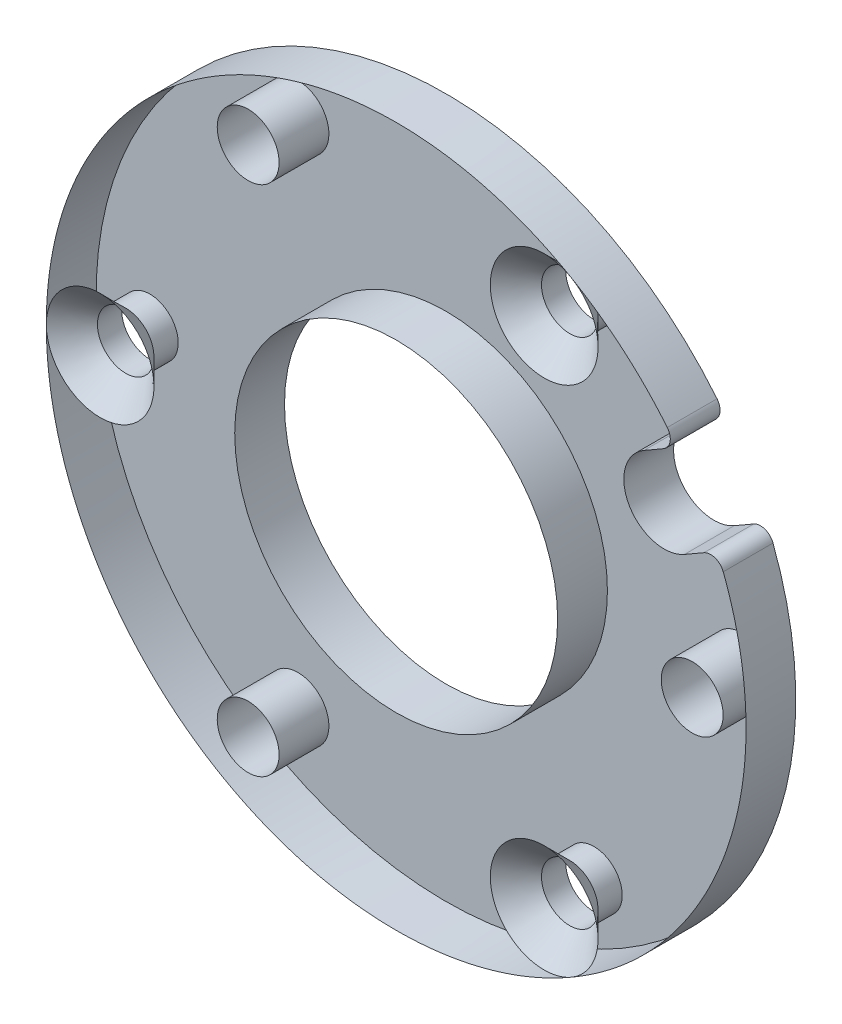
ISO-10303-21;
HEADER;
FILE_DESCRIPTION(('STEP AP214'),'2;1');
FILE_NAME('part.step','',(''),(''),'','','');
FILE_SCHEMA(('AUTOMOTIVE_DESIGN { 1 0 10303 214 1 1 1 1 }'));
ENDSEC;
DATA;
#1=APPLICATION_CONTEXT('core data for automotive mechanical design processes');
#2=APPLICATION_PROTOCOL_DEFINITION('international standard','automotive_design',2000,#1);
#3=PRODUCT_CONTEXT('',#1,'mechanical');
#4=PRODUCT('Part','Part','',(#3));
#5=PRODUCT_RELATED_PRODUCT_CATEGORY('part','',(#4));
#6=PRODUCT_DEFINITION_FORMATION('','',#4);
#7=PRODUCT_DEFINITION_CONTEXT('part definition',#1,'design');
#8=PRODUCT_DEFINITION('design','',#6,#7);
#9=PRODUCT_DEFINITION_SHAPE('','',#8);
#10=(LENGTH_UNIT() NAMED_UNIT(*) SI_UNIT(.MILLI.,.METRE.));
#11=(NAMED_UNIT(*) PLANE_ANGLE_UNIT() SI_UNIT($,.RADIAN.));
#12=(NAMED_UNIT(*) SI_UNIT($,.STERADIAN.) SOLID_ANGLE_UNIT());
#13=UNCERTAINTY_MEASURE_WITH_UNIT(LENGTH_MEASURE(1.E-05),#10,'distance_accuracy_value','');
#14=(GEOMETRIC_REPRESENTATION_CONTEXT(3) GLOBAL_UNCERTAINTY_ASSIGNED_CONTEXT((#13)) GLOBAL_UNIT_ASSIGNED_CONTEXT((#10,
#11,#12)) REPRESENTATION_CONTEXT('',''));
#15=CARTESIAN_POINT('',(0.,0.,0.));
#16=DIRECTION('',(0.,0.,1.));
#17=DIRECTION('',(1.,0.,0.));
#18=AXIS2_PLACEMENT_3D('',#15,#16,#17);
#19=CARTESIAN_POINT('',(0.,-1.35,12.05));
#20=DIRECTION('',(0.,0.,1.));
#21=DIRECTION('',(0.,1.,0.));
#22=AXIS2_PLACEMENT_3D('',#19,#20,#21);
#23=CYLINDRICAL_SURFACE('',#22,6.);
#24=CARTESIAN_POINT('',(0.,-1.35,13.9));
#25=DIRECTION('',(0.,0.,-1.));
#26=DIRECTION('',(0.,-1.,0.));
#27=AXIS2_PLACEMENT_3D('',#24,#25,#26);
#28=CIRCLE('',#27,6.);
#29=CARTESIAN_POINT('',(0.,-7.35,13.9));
#30=VERTEX_POINT('',#29);
#31=EDGE_CURVE('E126',#30,#30,#28,.T.);
#32=ORIENTED_EDGE('',*,*,#31,.F.);
#33=EDGE_LOOP('',(#32));
#34=FACE_BOUND('',#33,.T.);
#35=CARTESIAN_POINT('',(0.,-1.35,12.05));
#36=DIRECTION('',(0.,0.,1.));
#37=DIRECTION('',(0.,1.,0.));
#38=AXIS2_PLACEMENT_3D('',#35,#36,#37);
#39=CIRCLE('',#38,6.);
#40=CARTESIAN_POINT('',(0.,4.65,12.05));
#41=VERTEX_POINT('',#40);
#42=EDGE_CURVE('E11',#41,#41,#39,.T.);
#43=ORIENTED_EDGE('',*,*,#42,.F.);
#44=EDGE_LOOP('',(#43));
#45=FACE_BOUND('',#44,.T.);
#46=ADVANCED_FACE('F16',(#34,#45),#23,.F.);
#47=CARTESIAN_POINT('',(2.75,-6.113139720814,12.05));
#48=DIRECTION('',(0.,0.,1.));
#49=DIRECTION('',(1.,0.,0.));
#50=AXIS2_PLACEMENT_3D('',#47,#48,#49);
#51=PLANE('',#50);
#52=CARTESIAN_POINT('',(9.685855136581,6.551532147195,12.05));
#53=DIRECTION('',(0.,0.,-1.));
#54=DIRECTION('',(0.774868410926516,0.632122571775613,0.));
#55=AXIS2_PLACEMENT_3D('',#52,#53,#54);
#56=CIRCLE('',#55,0.5);
#57=CARTESIAN_POINT('',(10.07328934204,6.867593433083,12.05));
#58=VERTEX_POINT('',#57);
#59=CARTESIAN_POINT('',(9.935855136581,6.118519445303,12.05));
#60=VERTEX_POINT('',#59);
#61=EDGE_CURVE('E41',#58,#60,#56,.T.);
#62=ORIENTED_EDGE('',*,*,#61,.T.);
#63=DIRECTION('',(-0.866025403784429,-0.500000000000017,0.));
#64=VECTOR('',#63,1.);
#65=CARTESIAN_POINT('',(9.935855136581,6.118519445303,12.05));
#66=LINE('',#65,#64);
#67=CARTESIAN_POINT('',(9.209292143521,5.699038105677,12.05));
#68=VERTEX_POINT('',#67);
#69=EDGE_CURVE('E162',#60,#68,#66,.T.);
#70=ORIENTED_EDGE('',*,*,#69,.T.);
#71=CARTESIAN_POINT('',(9.959292143521,4.4,12.05));
#72=DIRECTION('',(0.,0.,1.));
#73=DIRECTION('',(-0.500000000000017,0.866025403784429,0.));
#74=AXIS2_PLACEMENT_3D('',#71,#72,#73);
#75=CIRCLE('',#74,1.5);
#76=CARTESIAN_POINT('',(10.70929214352,3.100961894323,12.05));
#77=VERTEX_POINT('',#76);
#78=EDGE_CURVE('E152',#68,#77,#75,.T.);
#79=ORIENTED_EDGE('',*,*,#78,.T.);
#80=DIRECTION('',(0.866025403784429,0.500000000000017,0.));
#81=VECTOR('',#80,1.);
#82=CARTESIAN_POINT('',(10.70929214352,3.100961894323,12.05));
#83=LINE('',#82,#81);
#84=CARTESIAN_POINT('',(11.43585513658,3.52044323395,12.05));
#85=VERTEX_POINT('',#84);
#86=EDGE_CURVE('E145',#77,#85,#83,.T.);
#87=ORIENTED_EDGE('',*,*,#86,.T.);
#88=CARTESIAN_POINT('',(11.68585513658,3.087430532058,12.05));
#89=DIRECTION('',(0.,0.,-1.));
#90=DIRECTION('',(-0.499999999999974,0.866025403784454,0.));
#91=AXIS2_PLACEMENT_3D('',#88,#89,#90);
#92=CIRCLE('',#91,0.5);
#93=CARTESIAN_POINT('',(12.15328934204,3.26492775334,12.05));
#94=VERTEX_POINT('',#93);
#95=EDGE_CURVE('E180',#85,#94,#92,.T.);
#96=ORIENTED_EDGE('',*,*,#95,.T.);
#97=CARTESIAN_POINT('',(0.,-1.35,12.05));
#98=DIRECTION('',(0.,0.,-1.));
#99=DIRECTION('',(0.934868410926505,0.354994442564601,0.));
#100=AXIS2_PLACEMENT_3D('',#97,#98,#99);
#101=CIRCLE('',#100,13.);
#102=EDGE_CURVE('E24',#94,#58,#101,.T.);
#103=ORIENTED_EDGE('',*,*,#102,.T.);
#104=EDGE_LOOP('',(#62,#70,#79,#87,#96,#103));
#105=FACE_BOUND('',#104,.T.);
#106=CARTESIAN_POINT('',(5.5,-10.87627944163,12.05));
#107=DIRECTION('',(0.,0.,1.));
#108=DIRECTION('',(0.,1.,0.));
#109=AXIS2_PLACEMENT_3D('',#106,#107,#108);
#110=CIRCLE('',#109,1.05);
#111=CARTESIAN_POINT('',(5.5,-9.82627944163,12.05));
#112=VERTEX_POINT('',#111);
#113=EDGE_CURVE('E184',#112,#112,#110,.T.);
#114=ORIENTED_EDGE('',*,*,#113,.T.);
#115=EDGE_LOOP('',(#114));
#116=FACE_BOUND('',#115,.T.);
#117=CARTESIAN_POINT('',(11.,-1.35,12.05));
#118=DIRECTION('',(0.,0.,1.));
#119=DIRECTION('',(0.,-1.,0.));
#120=AXIS2_PLACEMENT_3D('',#117,#118,#119);
#121=CIRCLE('',#120,1.15);
#122=CARTESIAN_POINT('',(11.,-2.5,12.05));
#123=VERTEX_POINT('',#122);
#124=EDGE_CURVE('E242',#123,#123,#121,.T.);
#125=ORIENTED_EDGE('',*,*,#124,.T.);
#126=EDGE_LOOP('',(#125));
#127=FACE_BOUND('',#126,.T.);
#128=CARTESIAN_POINT('',(5.5,8.176279441629,12.05));
#129=DIRECTION('',(0.,0.,1.));
#130=DIRECTION('',(0.,-1.,0.));
#131=AXIS2_PLACEMENT_3D('',#128,#129,#130);
#132=CIRCLE('',#131,1.05);
#133=CARTESIAN_POINT('',(5.5,7.126279441629,12.05));
#134=VERTEX_POINT('',#133);
#135=EDGE_CURVE('E237',#134,#134,#132,.T.);
#136=ORIENTED_EDGE('',*,*,#135,.T.);
#137=EDGE_LOOP('',(#136));
#138=FACE_BOUND('',#137,.T.);
#139=CARTESIAN_POINT('',(-5.5,-10.87627944163,12.05));
#140=DIRECTION('',(0.,0.,1.));
#141=DIRECTION('',(0.,-1.,0.));
#142=AXIS2_PLACEMENT_3D('',#139,#140,#141);
#143=CIRCLE('',#142,1.15);
#144=CARTESIAN_POINT('',(-5.5,-12.02627944163,12.05));
#145=VERTEX_POINT('',#144);
#146=EDGE_CURVE('E240',#145,#145,#143,.T.);
#147=ORIENTED_EDGE('',*,*,#146,.T.);
#148=EDGE_LOOP('',(#147));
#149=FACE_BOUND('',#148,.T.);
#150=ORIENTED_EDGE('',*,*,#42,.T.);
#151=EDGE_LOOP('',(#150));
#152=FACE_BOUND('',#151,.T.);
#153=CARTESIAN_POINT('',(-11.,-1.35,12.05));
#154=DIRECTION('',(0.,0.,1.));
#155=DIRECTION('',(0.,-1.,0.));
#156=AXIS2_PLACEMENT_3D('',#153,#154,#155);
#157=CIRCLE('',#156,1.05);
#158=CARTESIAN_POINT('',(-11.,-2.4,12.05));
#159=VERTEX_POINT('',#158);
#160=EDGE_CURVE('E176',#159,#159,#157,.T.);
#161=ORIENTED_EDGE('',*,*,#160,.T.);
#162=EDGE_LOOP('',(#161));
#163=FACE_BOUND('',#162,.T.);
#164=CARTESIAN_POINT('',(-5.5,8.176279441629,12.05));
#165=DIRECTION('',(0.,0.,1.));
#166=DIRECTION('',(0.,1.,0.));
#167=AXIS2_PLACEMENT_3D('',#164,#165,#166);
#168=CIRCLE('',#167,1.15);
#169=CARTESIAN_POINT('',(-5.5,9.326279441629,12.05));
#170=VERTEX_POINT('',#169);
#171=EDGE_CURVE('E265',#170,#170,#168,.T.);
#172=ORIENTED_EDGE('',*,*,#171,.T.);
#173=EDGE_LOOP('',(#172));
#174=FACE_BOUND('',#173,.T.);
#175=ADVANCED_FACE('F275',(#105,#116,#127,#138,#149,#152,#163,#174),#51,.F.);
#176=CARTESIAN_POINT('',(0.,-1.35,12.05));
#177=DIRECTION('',(0.,0.,1.));
#178=DIRECTION('',(0.,1.,0.));
#179=AXIS2_PLACEMENT_3D('',#176,#177,#178);
#180=CYLINDRICAL_SURFACE('',#179,13.);
#181=DIRECTION('',(0.,0.,1.));
#182=VECTOR('',#181,1.);
#183=CARTESIAN_POINT('',(10.07328934204,6.867593433083,12.05));
#184=LINE('',#183,#182);
#185=CARTESIAN_POINT('',(10.07328934204,6.867593433083,13.9));
#186=VERTEX_POINT('',#185);
#187=EDGE_CURVE('E165',#58,#186,#184,.T.);
#188=ORIENTED_EDGE('',*,*,#187,.F.);
#189=ORIENTED_EDGE('',*,*,#102,.F.);
#190=DIRECTION('',(0.,0.,-1.));
#191=VECTOR('',#190,1.);
#192=CARTESIAN_POINT('',(12.15328934204,3.26492775334,13.9));
#193=LINE('',#192,#191);
#194=CARTESIAN_POINT('',(12.15328934204,3.26492775334,13.9));
#195=VERTEX_POINT('',#194);
#196=EDGE_CURVE('E103',#195,#94,#193,.T.);
#197=ORIENTED_EDGE('',*,*,#196,.F.);
#198=CARTESIAN_POINT('',(0.,-1.35,13.9));
#199=DIRECTION('',(0.,0.,1.));
#200=DIRECTION('',(0.500000000000017,-0.866025403784429,0.));
#201=AXIS2_PLACEMENT_3D('',#198,#199,#200);
#202=CIRCLE('',#201,13.);
#203=CARTESIAN_POINT('',(6.5,-12.6083302492,13.9));
#204=VERTEX_POINT('',#203);
#205=EDGE_CURVE('E95',#204,#195,#202,.T.);
#206=ORIENTED_EDGE('',*,*,#205,.F.);
#207=CARTESIAN_POINT('',(0.,-1.35,13.9));
#208=DIRECTION('',(0.,0.,1.));
#209=DIRECTION('',(-1.,0.,0.));
#210=AXIS2_PLACEMENT_3D('',#207,#208,#209);
#211=CIRCLE('',#210,13.);
#212=CARTESIAN_POINT('',(-13.,-1.35,13.9));
#213=VERTEX_POINT('',#212);
#214=EDGE_CURVE('E100',#213,#204,#211,.T.);
#215=ORIENTED_EDGE('',*,*,#214,.F.);
#216=CARTESIAN_POINT('',(0.,-1.35,13.9));
#217=DIRECTION('',(0.,0.,1.));
#218=DIRECTION('',(0.500000000000017,0.866025403784429,0.));
#219=AXIS2_PLACEMENT_3D('',#216,#217,#218);
#220=CIRCLE('',#219,13.);
#221=CARTESIAN_POINT('',(6.5,9.908330249198,13.9));
#222=VERTEX_POINT('',#221);
#223=EDGE_CURVE('E120',#222,#213,#220,.T.);
#224=ORIENTED_EDGE('',*,*,#223,.F.);
#225=CARTESIAN_POINT('',(0.,-1.35,13.9));
#226=DIRECTION('',(0.,0.,1.));
#227=DIRECTION('',(0.774868410926516,0.632122571775613,0.));
#228=AXIS2_PLACEMENT_3D('',#225,#226,#227);
#229=CIRCLE('',#228,13.);
#230=EDGE_CURVE('E142',#186,#222,#229,.T.);
#231=ORIENTED_EDGE('',*,*,#230,.F.);
#232=EDGE_LOOP('',(#188,#189,#197,#206,#215,#224,#231));
#233=FACE_BOUND('',#232,.T.);
#234=ADVANCED_FACE('F98',(#233),#180,.T.);
#235=CARTESIAN_POINT('',(9.685855136581,6.551532147195,12.05));
#236=DIRECTION('',(0.,0.,1.));
#237=DIRECTION('',(0.,1.,0.));
#238=AXIS2_PLACEMENT_3D('',#235,#236,#237);
#239=CYLINDRICAL_SURFACE('',#238,0.5);
#240=ORIENTED_EDGE('',*,*,#187,.T.);
#241=CARTESIAN_POINT('',(9.685855136581,6.551532147195,13.9));
#242=DIRECTION('',(0.,0.,1.));
#243=DIRECTION('',(0.500000000000017,-0.866025403784429,0.));
#244=AXIS2_PLACEMENT_3D('',#241,#242,#243);
#245=CIRCLE('',#244,0.5);
#246=CARTESIAN_POINT('',(9.935855136581,6.118519445303,13.9));
#247=VERTEX_POINT('',#246);
#248=EDGE_CURVE('E141',#247,#186,#245,.T.);
#249=ORIENTED_EDGE('',*,*,#248,.F.);
#250=DIRECTION('',(0.,0.,-1.));
#251=VECTOR('',#250,1.);
#252=CARTESIAN_POINT('',(9.935855136581,6.118519445303,13.9));
#253=LINE('',#252,#251);
#254=EDGE_CURVE('E158',#247,#60,#253,.T.);
#255=ORIENTED_EDGE('',*,*,#254,.T.);
#256=ORIENTED_EDGE('',*,*,#61,.F.);
#257=EDGE_LOOP('',(#240,#249,#255,#256));
#258=FACE_BOUND('',#257,.T.);
#259=ADVANCED_FACE('F336',(#258),#239,.T.);
#260=CARTESIAN_POINT('',(10.43313462317,6.405623890749,12.));
#261=DIRECTION('',(-0.500000000000017,0.866025403784429,0.));
#262=DIRECTION('',(0.,0.,1.));
#263=AXIS2_PLACEMENT_3D('',#260,#261,#262);
#264=PLANE('',#263);
#265=ORIENTED_EDGE('',*,*,#254,.F.);
#266=DIRECTION('',(0.866025403784429,0.500000000000017,0.));
#267=VECTOR('',#266,1.);
#268=CARTESIAN_POINT('',(9.209292143521,5.699038105677,13.9));
#269=LINE('',#268,#267);
#270=CARTESIAN_POINT('',(9.209292143521,5.699038105677,13.9));
#271=VERTEX_POINT('',#270);
#272=EDGE_CURVE('E137',#271,#247,#269,.T.);
#273=ORIENTED_EDGE('',*,*,#272,.F.);
#274=DIRECTION('',(0.,0.,1.));
#275=VECTOR('',#274,1.);
#276=CARTESIAN_POINT('',(9.209292143521,5.699038105677,12.05));
#277=LINE('',#276,#275);
#278=EDGE_CURVE('E155',#68,#271,#277,.T.);
#279=ORIENTED_EDGE('',*,*,#278,.F.);
#280=ORIENTED_EDGE('',*,*,#69,.F.);
#281=EDGE_LOOP('',(#265,#273,#279,#280));
#282=FACE_BOUND('',#281,.T.);
#283=ADVANCED_FACE('F334',(#282),#264,.F.);
#284=CARTESIAN_POINT('',(9.959292143521,4.4,12.));
#285=DIRECTION('',(0.,0.,1.));
#286=DIRECTION('',(0.,1.,0.));
#287=AXIS2_PLACEMENT_3D('',#284,#285,#286);
#288=CYLINDRICAL_SURFACE('',#287,1.5);
#289=CARTESIAN_POINT('',(9.959292143521,4.4,13.9));
#290=DIRECTION('',(0.,0.,-1.));
#291=DIRECTION('',(0.,-1.,0.));
#292=AXIS2_PLACEMENT_3D('',#289,#290,#291);
#293=CIRCLE('',#292,1.5);
#294=CARTESIAN_POINT('',(10.70929214352,3.100961894323,13.9));
#295=VERTEX_POINT('',#294);
#296=EDGE_CURVE('E133',#295,#271,#293,.T.);
#297=ORIENTED_EDGE('',*,*,#296,.F.);
#298=DIRECTION('',(0.,0.,-1.));
#299=VECTOR('',#298,1.);
#300=CARTESIAN_POINT('',(10.70929214352,3.100961894323,13.9));
#301=LINE('',#300,#299);
#302=EDGE_CURVE('E148',#295,#77,#301,.T.);
#303=ORIENTED_EDGE('',*,*,#302,.T.);
#304=ORIENTED_EDGE('',*,*,#78,.F.);
#305=ORIENTED_EDGE('',*,*,#278,.T.);
#306=EDGE_LOOP('',(#297,#303,#304,#305));
#307=FACE_BOUND('',#306,.T.);
#308=ADVANCED_FACE('F330',(#307),#288,.F.);
#309=CARTESIAN_POINT('',(10.70929214352,3.100961894323,12.));
#310=DIRECTION('',(0.500000000000017,-0.866025403784429,0.));
#311=DIRECTION('',(0.,0.,-1.));
#312=AXIS2_PLACEMENT_3D('',#309,#310,#311);
#313=PLANE('',#312);
#314=DIRECTION('',(0.,0.,1.));
#315=VECTOR('',#314,1.);
#316=CARTESIAN_POINT('',(11.43585513658,3.52044323395,12.05));
#317=LINE('',#316,#315);
#318=CARTESIAN_POINT('',(11.43585513658,3.52044323395,13.9));
#319=VERTEX_POINT('',#318);
#320=EDGE_CURVE('E194',#85,#319,#317,.T.);
#321=ORIENTED_EDGE('',*,*,#320,.F.);
#322=ORIENTED_EDGE('',*,*,#86,.F.);
#323=ORIENTED_EDGE('',*,*,#302,.F.);
#324=DIRECTION('',(-0.866025403784429,-0.500000000000017,0.));
#325=VECTOR('',#324,1.);
#326=CARTESIAN_POINT('',(11.43585513658,3.52044323395,13.9));
#327=LINE('',#326,#325);
#328=EDGE_CURVE('E109',#319,#295,#327,.T.);
#329=ORIENTED_EDGE('',*,*,#328,.F.);
#330=EDGE_LOOP('',(#321,#322,#323,#329));
#331=FACE_BOUND('',#330,.T.);
#332=ADVANCED_FACE('F322',(#331),#313,.F.);
#333=CARTESIAN_POINT('',(2.75,-6.113139720814,13.9));
#334=DIRECTION('',(0.,0.,1.));
#335=DIRECTION('',(1.,0.,0.));
#336=AXIS2_PLACEMENT_3D('',#333,#334,#335);
#337=PLANE('',#336);
#338=CARTESIAN_POINT('',(5.5,8.176279441629,13.9));
#339=DIRECTION('',(0.,0.,-1.));
#340=DIRECTION('',(0.500000000000017,0.866025403784429,0.));
#341=AXIS2_PLACEMENT_3D('',#338,#339,#340);
#342=CIRCLE('',#341,2.);
#343=EDGE_CURVE('E224',#222,#222,#342,.T.);
#344=ORIENTED_EDGE('',*,*,#343,.T.);
#345=ORIENTED_EDGE('',*,*,#223,.T.);
#346=CARTESIAN_POINT('',(-11.,-1.35,13.9));
#347=DIRECTION('',(0.,0.,-1.));
#348=DIRECTION('',(-1.,0.,0.));
#349=AXIS2_PLACEMENT_3D('',#346,#347,#348);
#350=CIRCLE('',#349,2.);
#351=EDGE_CURVE('E118',#213,#213,#350,.T.);
#352=ORIENTED_EDGE('',*,*,#351,.T.);
#353=ORIENTED_EDGE('',*,*,#214,.T.);
#354=CARTESIAN_POINT('',(5.5,-10.87627944163,13.9));
#355=DIRECTION('',(0.,0.,-1.));
#356=DIRECTION('',(0.500000000000092,-0.866025403784386,0.));
#357=AXIS2_PLACEMENT_3D('',#354,#355,#356);
#358=CIRCLE('',#357,2.);
#359=EDGE_CURVE('E116',#204,#204,#358,.T.);
#360=ORIENTED_EDGE('',*,*,#359,.T.);
#361=ORIENTED_EDGE('',*,*,#205,.T.);
#362=CARTESIAN_POINT('',(11.68585513658,3.087430532058,13.9));
#363=DIRECTION('',(0.,0.,1.));
#364=DIRECTION('',(0.934868410926505,0.354994442564601,0.));
#365=AXIS2_PLACEMENT_3D('',#362,#363,#364);
#366=CIRCLE('',#365,0.5);
#367=EDGE_CURVE('E198',#195,#319,#366,.T.);
#368=ORIENTED_EDGE('',*,*,#367,.T.);
#369=ORIENTED_EDGE('',*,*,#328,.T.);
#370=ORIENTED_EDGE('',*,*,#296,.T.);
#371=ORIENTED_EDGE('',*,*,#272,.T.);
#372=ORIENTED_EDGE('',*,*,#248,.T.);
#373=ORIENTED_EDGE('',*,*,#230,.T.);
#374=EDGE_LOOP('',(#344,#345,#352,#353,#360,#361,#368,#369,#370,#371,#372,#373));
#375=FACE_BOUND('',#374,.T.);
#376=CARTESIAN_POINT('',(11.,-1.35,13.9));
#377=DIRECTION('',(0.,0.,-1.));
#378=DIRECTION('',(0.,1.,0.));
#379=AXIS2_PLACEMENT_3D('',#376,#377,#378);
#380=CIRCLE('',#379,1.15);
#381=CARTESIAN_POINT('',(11.,-0.2,13.9));
#382=VERTEX_POINT('',#381);
#383=EDGE_CURVE('E214',#382,#382,#380,.T.);
#384=ORIENTED_EDGE('',*,*,#383,.T.);
#385=EDGE_LOOP('',(#384));
#386=FACE_BOUND('',#385,.T.);
#387=CARTESIAN_POINT('',(-5.5,-10.87627944163,13.9));
#388=DIRECTION('',(0.,0.,-1.));
#389=DIRECTION('',(0.,1.,0.));
#390=AXIS2_PLACEMENT_3D('',#387,#388,#389);
#391=CIRCLE('',#390,1.15);
#392=CARTESIAN_POINT('',(-5.5,-9.72627944163,13.9));
#393=VERTEX_POINT('',#392);
#394=EDGE_CURVE('E245',#393,#393,#391,.T.);
#395=ORIENTED_EDGE('',*,*,#394,.T.);
#396=EDGE_LOOP('',(#395));
#397=FACE_BOUND('',#396,.T.);
#398=ORIENTED_EDGE('',*,*,#31,.T.);
#399=EDGE_LOOP('',(#398));
#400=FACE_BOUND('',#399,.T.);
#401=CARTESIAN_POINT('',(-5.5,8.176279441629,13.9));
#402=DIRECTION('',(0.,0.,-1.));
#403=DIRECTION('',(0.,-1.,0.));
#404=AXIS2_PLACEMENT_3D('',#401,#402,#403);
#405=CIRCLE('',#404,1.15);
#406=CARTESIAN_POINT('',(-5.5,7.026279441629,13.9));
#407=VERTEX_POINT('',#406);
#408=EDGE_CURVE('E260',#407,#407,#405,.T.);
#409=ORIENTED_EDGE('',*,*,#408,.T.);
#410=EDGE_LOOP('',(#409));
#411=FACE_BOUND('',#410,.T.);
#412=ADVANCED_FACE('F113',(#375,#386,#397,#400,#411),#337,.T.);
#413=CARTESIAN_POINT('',(11.68585513658,3.087430532058,12.05));
#414=DIRECTION('',(0.,0.,1.));
#415=DIRECTION('',(0.,1.,0.));
#416=AXIS2_PLACEMENT_3D('',#413,#414,#415);
#417=CYLINDRICAL_SURFACE('',#416,0.5);
#418=ORIENTED_EDGE('',*,*,#95,.F.);
#419=ORIENTED_EDGE('',*,*,#320,.T.);
#420=ORIENTED_EDGE('',*,*,#367,.F.);
#421=ORIENTED_EDGE('',*,*,#196,.T.);
#422=EDGE_LOOP('',(#418,#419,#420,#421));
#423=FACE_BOUND('',#422,.T.);
#424=ADVANCED_FACE('F321',(#423),#417,.T.);
#425=CARTESIAN_POINT('',(5.5,-10.87627944163,13.425));
#426=DIRECTION('',(0.,0.,1.));
#427=DIRECTION('',(0.,-1.,0.));
#428=AXIS2_PLACEMENT_3D('',#425,#426,#427);
#429=CONICAL_SURFACE('',#428,1.525,0.785398163397448);
#430=ORIENTED_EDGE('',*,*,#359,.F.);
#431=EDGE_LOOP('',(#430));
#432=FACE_BOUND('',#431,.T.);
#433=CARTESIAN_POINT('',(5.5,-10.87627944163,12.95));
#434=DIRECTION('',(0.,0.,-1.));
#435=DIRECTION('',(0.,1.,0.));
#436=AXIS2_PLACEMENT_3D('',#433,#434,#435);
#437=CIRCLE('',#436,1.05);
#438=CARTESIAN_POINT('',(5.5,-9.82627944163,12.95));
#439=VERTEX_POINT('',#438);
#440=EDGE_CURVE('E181',#439,#439,#437,.T.);
#441=ORIENTED_EDGE('',*,*,#440,.T.);
#442=EDGE_LOOP('',(#441));
#443=FACE_BOUND('',#442,.T.);
#444=ADVANCED_FACE('F328',(#432,#443),#429,.F.);
#445=CARTESIAN_POINT('',(5.5,-10.87627944163,12.05));
#446=DIRECTION('',(0.,0.,1.));
#447=DIRECTION('',(0.,1.,0.));
#448=AXIS2_PLACEMENT_3D('',#445,#446,#447);
#449=CYLINDRICAL_SURFACE('',#448,1.05);
#450=ORIENTED_EDGE('',*,*,#440,.F.);
#451=EDGE_LOOP('',(#450));
#452=FACE_BOUND('',#451,.T.);
#453=ORIENTED_EDGE('',*,*,#113,.F.);
#454=EDGE_LOOP('',(#453));
#455=FACE_BOUND('',#454,.T.);
#456=ADVANCED_FACE('F344',(#452,#455),#449,.F.);
#457=CARTESIAN_POINT('',(-11.,-1.35,13.425));
#458=DIRECTION('',(0.,0.,1.));
#459=DIRECTION('',(0.,1.,0.));
#460=AXIS2_PLACEMENT_3D('',#457,#458,#459);
#461=CONICAL_SURFACE('',#460,1.525,0.785398163397448);
#462=ORIENTED_EDGE('',*,*,#351,.F.);
#463=EDGE_LOOP('',(#462));
#464=FACE_BOUND('',#463,.T.);
#465=CARTESIAN_POINT('',(-11.,-1.35,12.95));
#466=DIRECTION('',(0.,0.,-1.));
#467=DIRECTION('',(0.,-1.,0.));
#468=AXIS2_PLACEMENT_3D('',#465,#466,#467);
#469=CIRCLE('',#468,1.05);
#470=CARTESIAN_POINT('',(-11.,-2.4,12.95));
#471=VERTEX_POINT('',#470);
#472=EDGE_CURVE('E185',#471,#471,#469,.T.);
#473=ORIENTED_EDGE('',*,*,#472,.T.);
#474=EDGE_LOOP('',(#473));
#475=FACE_BOUND('',#474,.T.);
#476=ADVANCED_FACE('F349',(#464,#475),#461,.F.);
#477=CARTESIAN_POINT('',(-11.,-1.35,12.05));
#478=DIRECTION('',(0.,0.,1.));
#479=DIRECTION('',(0.,1.,0.));
#480=AXIS2_PLACEMENT_3D('',#477,#478,#479);
#481=CYLINDRICAL_SURFACE('',#480,1.05);
#482=ORIENTED_EDGE('',*,*,#472,.F.);
#483=EDGE_LOOP('',(#482));
#484=FACE_BOUND('',#483,.T.);
#485=ORIENTED_EDGE('',*,*,#160,.F.);
#486=EDGE_LOOP('',(#485));
#487=FACE_BOUND('',#486,.T.);
#488=ADVANCED_FACE('F292',(#484,#487),#481,.F.);
#489=CARTESIAN_POINT('',(5.5,8.176279441629,13.425));
#490=DIRECTION('',(0.,0.,1.));
#491=DIRECTION('',(0.,1.,0.));
#492=AXIS2_PLACEMENT_3D('',#489,#490,#491);
#493=CONICAL_SURFACE('',#492,1.525,0.785398163397448);
#494=ORIENTED_EDGE('',*,*,#343,.F.);
#495=EDGE_LOOP('',(#494));
#496=FACE_BOUND('',#495,.T.);
#497=CARTESIAN_POINT('',(5.5,8.176279441629,12.95));
#498=DIRECTION('',(0.,0.,-1.));
#499=DIRECTION('',(0.,1.,0.));
#500=AXIS2_PLACEMENT_3D('',#497,#498,#499);
#501=CIRCLE('',#500,1.05);
#502=CARTESIAN_POINT('',(5.5,9.226279441629,12.95));
#503=VERTEX_POINT('',#502);
#504=EDGE_CURVE('E230',#503,#503,#501,.T.);
#505=ORIENTED_EDGE('',*,*,#504,.T.);
#506=EDGE_LOOP('',(#505));
#507=FACE_BOUND('',#506,.T.);
#508=ADVANCED_FACE('F281',(#496,#507),#493,.F.);
#509=CARTESIAN_POINT('',(5.5,8.176279441629,12.05));
#510=DIRECTION('',(0.,0.,1.));
#511=DIRECTION('',(0.,1.,0.));
#512=AXIS2_PLACEMENT_3D('',#509,#510,#511);
#513=CYLINDRICAL_SURFACE('',#512,1.05);
#514=ORIENTED_EDGE('',*,*,#504,.F.);
#515=EDGE_LOOP('',(#514));
#516=FACE_BOUND('',#515,.T.);
#517=ORIENTED_EDGE('',*,*,#135,.F.);
#518=EDGE_LOOP('',(#517));
#519=FACE_BOUND('',#518,.T.);
#520=ADVANCED_FACE('F278',(#516,#519),#513,.F.);
#521=CARTESIAN_POINT('',(11.,-1.35,12.05));
#522=DIRECTION('',(0.,0.,1.));
#523=DIRECTION('',(0.,1.,0.));
#524=AXIS2_PLACEMENT_3D('',#521,#522,#523);
#525=CYLINDRICAL_SURFACE('',#524,1.15);
#526=ORIENTED_EDGE('',*,*,#383,.F.);
#527=EDGE_LOOP('',(#526));
#528=FACE_BOUND('',#527,.T.);
#529=ORIENTED_EDGE('',*,*,#124,.F.);
#530=EDGE_LOOP('',(#529));
#531=FACE_BOUND('',#530,.T.);
#532=ADVANCED_FACE('F280',(#528,#531),#525,.F.);
#533=CARTESIAN_POINT('',(-5.5,-10.87627944163,12.05));
#534=DIRECTION('',(0.,0.,1.));
#535=DIRECTION('',(0.,1.,0.));
#536=AXIS2_PLACEMENT_3D('',#533,#534,#535);
#537=CYLINDRICAL_SURFACE('',#536,1.15);
#538=ORIENTED_EDGE('',*,*,#394,.F.);
#539=EDGE_LOOP('',(#538));
#540=FACE_BOUND('',#539,.T.);
#541=ORIENTED_EDGE('',*,*,#146,.F.);
#542=EDGE_LOOP('',(#541));
#543=FACE_BOUND('',#542,.T.);
#544=ADVANCED_FACE('F289',(#540,#543),#537,.F.);
#545=CARTESIAN_POINT('',(-5.5,8.176279441629,12.05));
#546=DIRECTION('',(0.,0.,1.));
#547=DIRECTION('',(0.,1.,0.));
#548=AXIS2_PLACEMENT_3D('',#545,#546,#547);
#549=CYLINDRICAL_SURFACE('',#548,1.15);
#550=ORIENTED_EDGE('',*,*,#408,.F.);
#551=EDGE_LOOP('',(#550));
#552=FACE_BOUND('',#551,.T.);
#553=ORIENTED_EDGE('',*,*,#171,.F.);
#554=EDGE_LOOP('',(#553));
#555=FACE_BOUND('',#554,.T.);
#556=ADVANCED_FACE('F309',(#552,#555),#549,.F.);
#557=CLOSED_SHELL('',(#46,#175,#234,#259,#283,#308,#332,#412,#424,#444,#456,#476,#488,#508,#520,
#532,#544,#556));
#558=MANIFOLD_SOLID_BREP('B1',#557);
#559=ADVANCED_BREP_SHAPE_REPRESENTATION('',(#18,#558),#14);
#560=SHAPE_DEFINITION_REPRESENTATION(#9,#559);
ENDSEC;
END-ISO-10303-21;
